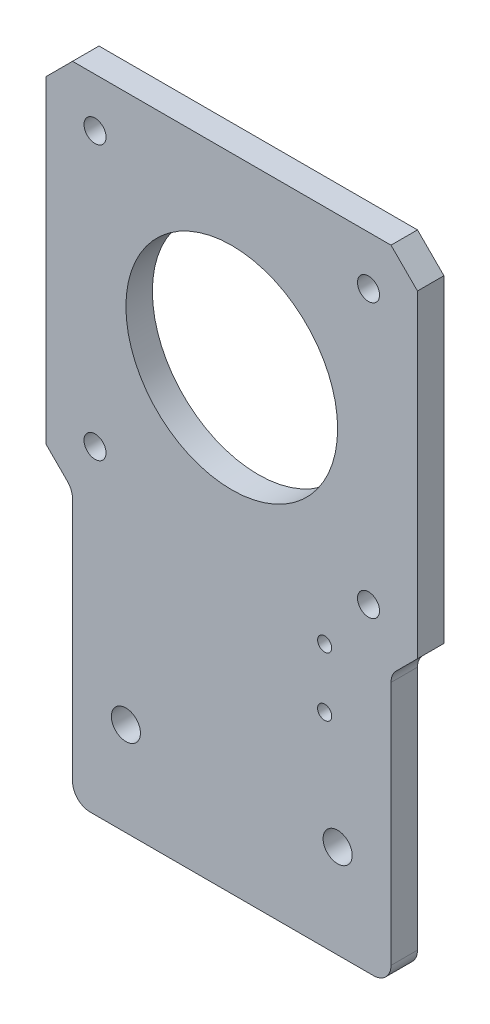
ISO-10303-21;
HEADER;
FILE_DESCRIPTION(('STEP AP214'),'2;1');
FILE_NAME('part.step','',(''),(''),'','','');
FILE_SCHEMA(('AUTOMOTIVE_DESIGN { 1 0 10303 214 1 1 1 1 }'));
ENDSEC;
DATA;
#1=APPLICATION_CONTEXT('core data for automotive mechanical design processes');
#2=APPLICATION_PROTOCOL_DEFINITION('international standard','automotive_design',2000,#1);
#3=PRODUCT_CONTEXT('',#1,'mechanical');
#4=PRODUCT('Part','Part','',(#3));
#5=PRODUCT_RELATED_PRODUCT_CATEGORY('part','',(#4));
#6=PRODUCT_DEFINITION_FORMATION('','',#4);
#7=PRODUCT_DEFINITION_CONTEXT('part definition',#1,'design');
#8=PRODUCT_DEFINITION('design','',#6,#7);
#9=PRODUCT_DEFINITION_SHAPE('','',#8);
#10=(LENGTH_UNIT() NAMED_UNIT(*) SI_UNIT(.MILLI.,.METRE.));
#11=(NAMED_UNIT(*) PLANE_ANGLE_UNIT() SI_UNIT($,.RADIAN.));
#12=(NAMED_UNIT(*) SI_UNIT($,.STERADIAN.) SOLID_ANGLE_UNIT());
#13=UNCERTAINTY_MEASURE_WITH_UNIT(LENGTH_MEASURE(1.E-05),#10,'distance_accuracy_value','');
#14=(GEOMETRIC_REPRESENTATION_CONTEXT(3) GLOBAL_UNCERTAINTY_ASSIGNED_CONTEXT((#13)) GLOBAL_UNIT_ASSIGNED_CONTEXT((#10,
#11,#12)) REPRESENTATION_CONTEXT('',''));
#15=CARTESIAN_POINT('',(0.,0.,0.));
#16=DIRECTION('',(0.,0.,1.));
#17=DIRECTION('',(1.,0.,0.));
#18=AXIS2_PLACEMENT_3D('',#15,#16,#17);
#19=CARTESIAN_POINT('',(0.,0.,3.));
#20=DIRECTION('',(0.,0.,-1.));
#21=DIRECTION('',(-1.,0.,0.));
#22=AXIS2_PLACEMENT_3D('',#19,#20,#21);
#23=PLANE('',#22);
#24=CARTESIAN_POINT('',(10.5294560297045,-21.8613101499908,3.));
#25=DIRECTION('',(0.,0.,1.));
#26=DIRECTION('',(1.,0.,0.));
#27=AXIS2_PLACEMENT_3D('',#24,#25,#26);
#28=CIRCLE('',#27,0.799999999999999);
#29=CARTESIAN_POINT('',(11.3294560297045,-21.8613101499908,3.));
#30=VERTEX_POINT('',#29);
#31=EDGE_CURVE('E327',#30,#30,#28,.T.);
#32=ORIENTED_EDGE('',*,*,#31,.F.);
#33=EDGE_LOOP('',(#32));
#34=FACE_BOUND('',#33,.T.);
#35=CARTESIAN_POINT('',(10.5294560297045,-28.5613101499908,3.));
#36=DIRECTION('',(0.,0.,1.));
#37=DIRECTION('',(1.,0.,0.));
#38=AXIS2_PLACEMENT_3D('',#35,#36,#37);
#39=CIRCLE('',#38,0.799999999999999);
#40=CARTESIAN_POINT('',(11.3294560297045,-28.5613101499908,3.));
#41=VERTEX_POINT('',#40);
#42=EDGE_CURVE('E329',#41,#41,#39,.T.);
#43=ORIENTED_EDGE('',*,*,#42,.F.);
#44=EDGE_LOOP('',(#43));
#45=FACE_BOUND('',#44,.T.);
#46=CARTESIAN_POINT('',(12.,-41.0549999999989,3.));
#47=DIRECTION('',(0.,0.,1.));
#48=DIRECTION('',(1.,0.,0.));
#49=AXIS2_PLACEMENT_3D('',#46,#47,#48);
#50=CIRCLE('',#49,1.65);
#51=CARTESIAN_POINT('',(13.65,-41.0549999999989,3.));
#52=VERTEX_POINT('',#51);
#53=EDGE_CURVE('E336',#52,#52,#50,.T.);
#54=ORIENTED_EDGE('',*,*,#53,.F.);
#55=EDGE_LOOP('',(#54));
#56=FACE_BOUND('',#55,.T.);
#57=CARTESIAN_POINT('',(-12.,-41.0549999999989,3.));
#58=DIRECTION('',(0.,0.,1.));
#59=DIRECTION('',(1.,0.,0.));
#60=AXIS2_PLACEMENT_3D('',#57,#58,#59);
#61=CIRCLE('',#60,1.65);
#62=CARTESIAN_POINT('',(-10.35,-41.0549999999989,3.));
#63=VERTEX_POINT('',#62);
#64=EDGE_CURVE('E342',#63,#63,#61,.T.);
#65=ORIENTED_EDGE('',*,*,#64,.F.);
#66=EDGE_LOOP('',(#65));
#67=FACE_BOUND('',#66,.T.);
#68=CARTESIAN_POINT('',(-15.5,15.4999999999999,3.));
#69=DIRECTION('',(0.,0.,1.));
#70=DIRECTION('',(1.,0.,0.));
#71=AXIS2_PLACEMENT_3D('',#68,#69,#70);
#72=CIRCLE('',#71,1.24999999999999);
#73=CARTESIAN_POINT('',(-14.25,15.4999999999999,3.));
#74=VERTEX_POINT('',#73);
#75=EDGE_CURVE('E348',#74,#74,#72,.T.);
#76=ORIENTED_EDGE('',*,*,#75,.F.);
#77=EDGE_LOOP('',(#76));
#78=FACE_BOUND('',#77,.T.);
#79=CARTESIAN_POINT('',(15.5,15.4999999999999,3.));
#80=DIRECTION('',(0.,0.,1.));
#81=DIRECTION('',(1.,0.,0.));
#82=AXIS2_PLACEMENT_3D('',#79,#80,#81);
#83=CIRCLE('',#82,1.24999999999999);
#84=CARTESIAN_POINT('',(16.75,15.4999999999999,3.));
#85=VERTEX_POINT('',#84);
#86=EDGE_CURVE('E354',#85,#85,#83,.T.);
#87=ORIENTED_EDGE('',*,*,#86,.F.);
#88=EDGE_LOOP('',(#87));
#89=FACE_BOUND('',#88,.T.);
#90=CARTESIAN_POINT('',(-15.5,-15.5000000000001,3.));
#91=DIRECTION('',(0.,0.,1.));
#92=DIRECTION('',(1.,0.,0.));
#93=AXIS2_PLACEMENT_3D('',#90,#91,#92);
#94=CIRCLE('',#93,1.24999999999999);
#95=CARTESIAN_POINT('',(-14.25,-15.5000000000001,3.));
#96=VERTEX_POINT('',#95);
#97=EDGE_CURVE('E360',#96,#96,#94,.T.);
#98=ORIENTED_EDGE('',*,*,#97,.F.);
#99=EDGE_LOOP('',(#98));
#100=FACE_BOUND('',#99,.T.);
#101=CARTESIAN_POINT('',(15.5,-15.5000000000001,3.));
#102=DIRECTION('',(0.,0.,1.));
#103=DIRECTION('',(1.,0.,0.));
#104=AXIS2_PLACEMENT_3D('',#101,#102,#103);
#105=CIRCLE('',#104,1.24999999999999);
#106=CARTESIAN_POINT('',(16.75,-15.5000000000001,3.));
#107=VERTEX_POINT('',#106);
#108=EDGE_CURVE('E366',#107,#107,#105,.T.);
#109=ORIENTED_EDGE('',*,*,#108,.F.);
#110=EDGE_LOOP('',(#109));
#111=FACE_BOUND('',#110,.T.);
#112=DIRECTION('',(1.,0.,0.));
#113=VECTOR('',#112,1.);
#114=CARTESIAN_POINT('',(18.05,-51.6550000000001,3.));
#115=LINE('',#114,#113);
#116=CARTESIAN_POINT('',(-16.05,-51.6550000000001,3.));
#117=VERTEX_POINT('',#116);
#118=CARTESIAN_POINT('',(16.05,-51.6550000000001,3.));
#119=VERTEX_POINT('',#118);
#120=EDGE_CURVE('E208',#117,#119,#115,.T.);
#121=ORIENTED_EDGE('',*,*,#120,.T.);
#122=CARTESIAN_POINT('',(16.05,-49.6550000000001,3.));
#123=DIRECTION('',(0.,0.,-1.));
#124=DIRECTION('',(-1.,0.,0.));
#125=AXIS2_PLACEMENT_3D('',#122,#123,#124);
#126=CIRCLE('',#125,2.);
#127=CARTESIAN_POINT('',(18.05,-49.6550000000001,3.));
#128=VERTEX_POINT('',#127);
#129=EDGE_CURVE('E185',#119,#128,#126,.F.);
#130=ORIENTED_EDGE('',*,*,#129,.T.);
#131=DIRECTION('',(0.,1.,0.));
#132=VECTOR('',#131,1.);
#133=CARTESIAN_POINT('',(18.05,-51.6550000000001,3.));
#134=LINE('',#133,#132);
#135=CARTESIAN_POINT('',(18.05,-21.8784271247463,3.));
#136=VERTEX_POINT('',#135);
#137=EDGE_CURVE('E210',#128,#136,#134,.T.);
#138=ORIENTED_EDGE('',*,*,#137,.T.);
#139=CARTESIAN_POINT('',(20.05,-21.8784271247463,3.));
#140=DIRECTION('',(0.,0.,-1.));
#141=DIRECTION('',(-1.,0.,0.));
#142=AXIS2_PLACEMENT_3D('',#139,#140,#141);
#143=CIRCLE('',#142,2.);
#144=CARTESIAN_POINT('',(18.6357864376269,-20.4642135623732,3.));
#145=VERTEX_POINT('',#144);
#146=EDGE_CURVE('E194',#136,#145,#143,.T.);
#147=ORIENTED_EDGE('',*,*,#146,.T.);
#148=DIRECTION('',(0.707106781186547,0.707106781186548,0.));
#149=VECTOR('',#148,1.);
#150=CARTESIAN_POINT('',(18.05,-21.0500000000001,3.));
#151=LINE('',#150,#149);
#152=CARTESIAN_POINT('',(21.05,-18.0500000000001,3.));
#153=VERTEX_POINT('',#152);
#154=EDGE_CURVE('E215',#145,#153,#151,.T.);
#155=ORIENTED_EDGE('',*,*,#154,.T.);
#156=DIRECTION('',(0.,1.,0.));
#157=VECTOR('',#156,1.);
#158=CARTESIAN_POINT('',(21.05,-18.0500000000001,3.));
#159=LINE('',#158,#157);
#160=CARTESIAN_POINT('',(21.05,18.0499999999999,3.));
#161=VERTEX_POINT('',#160);
#162=EDGE_CURVE('E217',#153,#161,#159,.T.);
#163=ORIENTED_EDGE('',*,*,#162,.T.);
#164=DIRECTION('',(-0.707106781186547,0.707106781186548,0.));
#165=VECTOR('',#164,1.);
#166=CARTESIAN_POINT('',(21.05,18.0499999999999,3.));
#167=LINE('',#166,#165);
#168=CARTESIAN_POINT('',(18.05,21.0499999999999,3.));
#169=VERTEX_POINT('',#168);
#170=EDGE_CURVE('E219',#161,#169,#167,.T.);
#171=ORIENTED_EDGE('',*,*,#170,.T.);
#172=DIRECTION('',(-1.,0.,0.));
#173=VECTOR('',#172,1.);
#174=CARTESIAN_POINT('',(18.05,21.0499999999999,3.));
#175=LINE('',#174,#173);
#176=CARTESIAN_POINT('',(-18.05,21.0499999999999,3.));
#177=VERTEX_POINT('',#176);
#178=EDGE_CURVE('E221',#169,#177,#175,.T.);
#179=ORIENTED_EDGE('',*,*,#178,.T.);
#180=DIRECTION('',(-0.707106781186547,-0.707106781186548,0.));
#181=VECTOR('',#180,1.);
#182=CARTESIAN_POINT('',(-18.05,21.0499999999999,3.));
#183=LINE('',#182,#181);
#184=CARTESIAN_POINT('',(-21.05,18.0499999999999,3.));
#185=VERTEX_POINT('',#184);
#186=EDGE_CURVE('E150',#177,#185,#183,.T.);
#187=ORIENTED_EDGE('',*,*,#186,.T.);
#188=DIRECTION('',(0.,-1.,0.));
#189=VECTOR('',#188,1.);
#190=CARTESIAN_POINT('',(-21.05,18.0499999999999,3.));
#191=LINE('',#190,#189);
#192=CARTESIAN_POINT('',(-21.05,-18.0500000000001,3.));
#193=VERTEX_POINT('',#192);
#194=EDGE_CURVE('E144',#185,#193,#191,.T.);
#195=ORIENTED_EDGE('',*,*,#194,.T.);
#196=DIRECTION('',(0.707106781186548,-0.707106781186548,0.));
#197=VECTOR('',#196,1.);
#198=CARTESIAN_POINT('',(-21.05,-18.0500000000001,3.));
#199=LINE('',#198,#197);
#200=CARTESIAN_POINT('',(-18.6357864376269,-20.4642135623732,3.));
#201=VERTEX_POINT('',#200);
#202=EDGE_CURVE('E134',#193,#201,#199,.T.);
#203=ORIENTED_EDGE('',*,*,#202,.T.);
#204=CARTESIAN_POINT('',(-20.05,-21.8784271247463,3.));
#205=DIRECTION('',(0.,0.,-1.));
#206=DIRECTION('',(-1.,0.,0.));
#207=AXIS2_PLACEMENT_3D('',#204,#205,#206);
#208=CIRCLE('',#207,2.);
#209=CARTESIAN_POINT('',(-18.05,-21.8784271247463,3.));
#210=VERTEX_POINT('',#209);
#211=EDGE_CURVE('E11',#201,#210,#208,.T.);
#212=ORIENTED_EDGE('',*,*,#211,.T.);
#213=DIRECTION('',(0.,-1.,0.));
#214=VECTOR('',#213,1.);
#215=CARTESIAN_POINT('',(-18.05,-51.6550000000001,3.));
#216=LINE('',#215,#214);
#217=CARTESIAN_POINT('',(-18.05,-49.6550000000001,3.));
#218=VERTEX_POINT('',#217);
#219=EDGE_CURVE('E143',#210,#218,#216,.T.);
#220=ORIENTED_EDGE('',*,*,#219,.T.);
#221=CARTESIAN_POINT('',(-16.05,-49.6550000000001,3.));
#222=DIRECTION('',(0.,0.,-1.));
#223=DIRECTION('',(-1.,0.,0.));
#224=AXIS2_PLACEMENT_3D('',#221,#222,#223);
#225=CIRCLE('',#224,2.);
#226=EDGE_CURVE('E183',#218,#117,#225,.F.);
#227=ORIENTED_EDGE('',*,*,#226,.T.);
#228=EDGE_LOOP('',(#121,#130,#138,#147,#155,#163,#171,#179,#187,#195,#203,#212,#220,#227));
#229=FACE_BOUND('',#228,.T.);
#230=CARTESIAN_POINT('',(0.,-1.11022302462516E-13,3.));
#231=DIRECTION('',(0.,0.,1.));
#232=DIRECTION('',(1.,0.,0.));
#233=AXIS2_PLACEMENT_3D('',#230,#231,#232);
#234=CIRCLE('',#233,12.);
#235=CARTESIAN_POINT('',(12.,-1.11022302462516E-13,3.));
#236=VERTEX_POINT('',#235);
#237=EDGE_CURVE('E225',#236,#236,#234,.T.);
#238=ORIENTED_EDGE('',*,*,#237,.F.);
#239=EDGE_LOOP('',(#238));
#240=FACE_BOUND('',#239,.T.);
#241=ADVANCED_FACE('F33',(#34,#45,#56,#67,#78,#89,#100,#111,#229,#240),#23,.F.);
#242=CARTESIAN_POINT('',(0.,0.,0.));
#243=DIRECTION('',(0.,0.,-1.));
#244=DIRECTION('',(-1.,0.,0.));
#245=AXIS2_PLACEMENT_3D('',#242,#243,#244);
#246=PLANE('',#245);
#247=CARTESIAN_POINT('',(10.5294560297045,-21.8613101499908,0.));
#248=DIRECTION('',(0.,0.,-1.));
#249=DIRECTION('',(-1.,0.,0.));
#250=AXIS2_PLACEMENT_3D('',#247,#248,#249);
#251=CIRCLE('',#250,0.799999999999999);
#252=CARTESIAN_POINT('',(9.72945602970451,-21.8613101499908,0.));
#253=VERTEX_POINT('',#252);
#254=EDGE_CURVE('E37',#253,#253,#251,.T.);
#255=ORIENTED_EDGE('',*,*,#254,.F.);
#256=EDGE_LOOP('',(#255));
#257=FACE_BOUND('',#256,.T.);
#258=CARTESIAN_POINT('',(10.5294560297045,-28.5613101499908,0.));
#259=DIRECTION('',(0.,0.,-1.));
#260=DIRECTION('',(-1.,0.,0.));
#261=AXIS2_PLACEMENT_3D('',#258,#259,#260);
#262=CIRCLE('',#261,0.799999999999999);
#263=CARTESIAN_POINT('',(9.72945602970451,-28.5613101499908,0.));
#264=VERTEX_POINT('',#263);
#265=EDGE_CURVE('E333',#264,#264,#262,.T.);
#266=ORIENTED_EDGE('',*,*,#265,.F.);
#267=EDGE_LOOP('',(#266));
#268=FACE_BOUND('',#267,.T.);
#269=CARTESIAN_POINT('',(12.,-41.0549999999989,0.));
#270=DIRECTION('',(0.,0.,-1.));
#271=DIRECTION('',(-1.,0.,0.));
#272=AXIS2_PLACEMENT_3D('',#269,#270,#271);
#273=CIRCLE('',#272,1.65);
#274=CARTESIAN_POINT('',(10.35,-41.0549999999989,0.));
#275=VERTEX_POINT('',#274);
#276=EDGE_CURVE('E339',#275,#275,#273,.T.);
#277=ORIENTED_EDGE('',*,*,#276,.F.);
#278=EDGE_LOOP('',(#277));
#279=FACE_BOUND('',#278,.T.);
#280=CARTESIAN_POINT('',(-12.,-41.0549999999989,0.));
#281=DIRECTION('',(0.,0.,-1.));
#282=DIRECTION('',(-1.,0.,0.));
#283=AXIS2_PLACEMENT_3D('',#280,#281,#282);
#284=CIRCLE('',#283,1.65);
#285=CARTESIAN_POINT('',(-13.65,-41.0549999999989,0.));
#286=VERTEX_POINT('',#285);
#287=EDGE_CURVE('E345',#286,#286,#284,.T.);
#288=ORIENTED_EDGE('',*,*,#287,.F.);
#289=EDGE_LOOP('',(#288));
#290=FACE_BOUND('',#289,.T.);
#291=CARTESIAN_POINT('',(-15.5,15.4999999999999,0.));
#292=DIRECTION('',(0.,0.,-1.));
#293=DIRECTION('',(-1.,0.,0.));
#294=AXIS2_PLACEMENT_3D('',#291,#292,#293);
#295=CIRCLE('',#294,1.24999999999999);
#296=CARTESIAN_POINT('',(-16.75,15.4999999999999,0.));
#297=VERTEX_POINT('',#296);
#298=EDGE_CURVE('E351',#297,#297,#295,.T.);
#299=ORIENTED_EDGE('',*,*,#298,.F.);
#300=EDGE_LOOP('',(#299));
#301=FACE_BOUND('',#300,.T.);
#302=CARTESIAN_POINT('',(15.5,15.4999999999999,0.));
#303=DIRECTION('',(0.,0.,-1.));
#304=DIRECTION('',(-1.,0.,0.));
#305=AXIS2_PLACEMENT_3D('',#302,#303,#304);
#306=CIRCLE('',#305,1.24999999999999);
#307=CARTESIAN_POINT('',(14.25,15.4999999999999,0.));
#308=VERTEX_POINT('',#307);
#309=EDGE_CURVE('E357',#308,#308,#306,.T.);
#310=ORIENTED_EDGE('',*,*,#309,.F.);
#311=EDGE_LOOP('',(#310));
#312=FACE_BOUND('',#311,.T.);
#313=CARTESIAN_POINT('',(-15.5,-15.5000000000001,0.));
#314=DIRECTION('',(0.,0.,-1.));
#315=DIRECTION('',(-1.,0.,0.));
#316=AXIS2_PLACEMENT_3D('',#313,#314,#315);
#317=CIRCLE('',#316,1.24999999999999);
#318=CARTESIAN_POINT('',(-16.75,-15.5000000000001,0.));
#319=VERTEX_POINT('',#318);
#320=EDGE_CURVE('E363',#319,#319,#317,.T.);
#321=ORIENTED_EDGE('',*,*,#320,.F.);
#322=EDGE_LOOP('',(#321));
#323=FACE_BOUND('',#322,.T.);
#324=CARTESIAN_POINT('',(15.5,-15.5000000000001,0.));
#325=DIRECTION('',(0.,0.,-1.));
#326=DIRECTION('',(-1.,0.,0.));
#327=AXIS2_PLACEMENT_3D('',#324,#325,#326);
#328=CIRCLE('',#327,1.24999999999999);
#329=CARTESIAN_POINT('',(14.25,-15.5000000000001,0.));
#330=VERTEX_POINT('',#329);
#331=EDGE_CURVE('E369',#330,#330,#328,.T.);
#332=ORIENTED_EDGE('',*,*,#331,.F.);
#333=EDGE_LOOP('',(#332));
#334=FACE_BOUND('',#333,.T.);
#335=DIRECTION('',(0.,1.,0.));
#336=VECTOR('',#335,1.);
#337=CARTESIAN_POINT('',(18.05,-51.6550000000001,0.));
#338=LINE('',#337,#336);
#339=CARTESIAN_POINT('',(18.05,-49.6550000000001,0.));
#340=VERTEX_POINT('',#339);
#341=CARTESIAN_POINT('',(18.05,-21.8784271247463,0.));
#342=VERTEX_POINT('',#341);
#343=EDGE_CURVE('E231',#340,#342,#338,.T.);
#344=ORIENTED_EDGE('',*,*,#343,.F.);
#345=CARTESIAN_POINT('',(16.05,-49.6550000000001,0.));
#346=DIRECTION('',(0.,0.,-1.));
#347=DIRECTION('',(-1.,0.,0.));
#348=AXIS2_PLACEMENT_3D('',#345,#346,#347);
#349=CIRCLE('',#348,2.);
#350=CARTESIAN_POINT('',(16.05,-51.6550000000001,0.));
#351=VERTEX_POINT('',#350);
#352=EDGE_CURVE('E176',#340,#351,#349,.T.);
#353=ORIENTED_EDGE('',*,*,#352,.T.);
#354=DIRECTION('',(1.,0.,0.));
#355=VECTOR('',#354,1.);
#356=CARTESIAN_POINT('',(18.05,-51.6550000000001,0.));
#357=LINE('',#356,#355);
#358=CARTESIAN_POINT('',(-16.05,-51.6550000000001,0.));
#359=VERTEX_POINT('',#358);
#360=EDGE_CURVE('E228',#359,#351,#357,.T.);
#361=ORIENTED_EDGE('',*,*,#360,.F.);
#362=CARTESIAN_POINT('',(-16.05,-49.6550000000001,0.));
#363=DIRECTION('',(0.,0.,-1.));
#364=DIRECTION('',(-1.,0.,0.));
#365=AXIS2_PLACEMENT_3D('',#362,#363,#364);
#366=CIRCLE('',#365,2.);
#367=CARTESIAN_POINT('',(-18.05,-49.6550000000001,0.));
#368=VERTEX_POINT('',#367);
#369=EDGE_CURVE('E174',#359,#368,#366,.T.);
#370=ORIENTED_EDGE('',*,*,#369,.T.);
#371=DIRECTION('',(0.,-1.,0.));
#372=VECTOR('',#371,1.);
#373=CARTESIAN_POINT('',(-18.05,-51.6550000000001,0.));
#374=LINE('',#373,#372);
#375=CARTESIAN_POINT('',(-18.05,-21.8784271247463,0.));
#376=VERTEX_POINT('',#375);
#377=EDGE_CURVE('E202',#376,#368,#374,.T.);
#378=ORIENTED_EDGE('',*,*,#377,.F.);
#379=CARTESIAN_POINT('',(-20.05,-21.8784271247463,0.));
#380=DIRECTION('',(0.,0.,-1.));
#381=DIRECTION('',(-1.,0.,0.));
#382=AXIS2_PLACEMENT_3D('',#379,#380,#381);
#383=CIRCLE('',#382,2.);
#384=CARTESIAN_POINT('',(-18.6357864376269,-20.4642135623732,0.));
#385=VERTEX_POINT('',#384);
#386=EDGE_CURVE('E42',#376,#385,#383,.F.);
#387=ORIENTED_EDGE('',*,*,#386,.T.);
#388=DIRECTION('',(0.707106781186548,-0.707106781186548,0.));
#389=VECTOR('',#388,1.);
#390=CARTESIAN_POINT('',(-21.05,-18.0500000000001,0.));
#391=LINE('',#390,#389);
#392=CARTESIAN_POINT('',(-21.05,-18.0500000000001,0.));
#393=VERTEX_POINT('',#392);
#394=EDGE_CURVE('E201',#393,#385,#391,.T.);
#395=ORIENTED_EDGE('',*,*,#394,.F.);
#396=DIRECTION('',(0.,-1.,0.));
#397=VECTOR('',#396,1.);
#398=CARTESIAN_POINT('',(-21.05,18.0499999999999,0.));
#399=LINE('',#398,#397);
#400=CARTESIAN_POINT('',(-21.05,18.0499999999999,0.));
#401=VERTEX_POINT('',#400);
#402=EDGE_CURVE('E158',#401,#393,#399,.T.);
#403=ORIENTED_EDGE('',*,*,#402,.F.);
#404=DIRECTION('',(-0.707106781186547,-0.707106781186548,0.));
#405=VECTOR('',#404,1.);
#406=CARTESIAN_POINT('',(-18.05,21.0499999999999,0.));
#407=LINE('',#406,#405);
#408=CARTESIAN_POINT('',(-18.05,21.0499999999999,0.));
#409=VERTEX_POINT('',#408);
#410=EDGE_CURVE('E154',#409,#401,#407,.T.);
#411=ORIENTED_EDGE('',*,*,#410,.F.);
#412=DIRECTION('',(-1.,0.,0.));
#413=VECTOR('',#412,1.);
#414=CARTESIAN_POINT('',(18.05,21.0499999999999,0.));
#415=LINE('',#414,#413);
#416=CARTESIAN_POINT('',(18.05,21.0499999999999,0.));
#417=VERTEX_POINT('',#416);
#418=EDGE_CURVE('E240',#417,#409,#415,.T.);
#419=ORIENTED_EDGE('',*,*,#418,.F.);
#420=DIRECTION('',(-0.707106781186547,0.707106781186548,0.));
#421=VECTOR('',#420,1.);
#422=CARTESIAN_POINT('',(21.05,18.0499999999999,0.));
#423=LINE('',#422,#421);
#424=CARTESIAN_POINT('',(21.05,18.0499999999999,0.));
#425=VERTEX_POINT('',#424);
#426=EDGE_CURVE('E238',#425,#417,#423,.T.);
#427=ORIENTED_EDGE('',*,*,#426,.F.);
#428=DIRECTION('',(0.,1.,0.));
#429=VECTOR('',#428,1.);
#430=CARTESIAN_POINT('',(21.05,-18.0500000000001,0.));
#431=LINE('',#430,#429);
#432=CARTESIAN_POINT('',(21.05,-18.0500000000001,0.));
#433=VERTEX_POINT('',#432);
#434=EDGE_CURVE('E236',#433,#425,#431,.T.);
#435=ORIENTED_EDGE('',*,*,#434,.F.);
#436=DIRECTION('',(0.707106781186547,0.707106781186548,0.));
#437=VECTOR('',#436,1.);
#438=CARTESIAN_POINT('',(18.05,-21.0500000000001,0.));
#439=LINE('',#438,#437);
#440=CARTESIAN_POINT('',(18.6357864376269,-20.4642135623732,0.));
#441=VERTEX_POINT('',#440);
#442=EDGE_CURVE('E234',#441,#433,#439,.T.);
#443=ORIENTED_EDGE('',*,*,#442,.F.);
#444=CARTESIAN_POINT('',(20.05,-21.8784271247463,0.));
#445=DIRECTION('',(0.,0.,-1.));
#446=DIRECTION('',(-1.,0.,0.));
#447=AXIS2_PLACEMENT_3D('',#444,#445,#446);
#448=CIRCLE('',#447,2.);
#449=EDGE_CURVE('E192',#441,#342,#448,.F.);
#450=ORIENTED_EDGE('',*,*,#449,.T.);
#451=EDGE_LOOP('',(#344,#353,#361,#370,#378,#387,#395,#403,#411,#419,#427,#435,#443,#450));
#452=FACE_BOUND('',#451,.T.);
#453=CARTESIAN_POINT('',(0.,-1.11022302462516E-13,0.));
#454=DIRECTION('',(0.,0.,1.));
#455=DIRECTION('',(1.,0.,0.));
#456=AXIS2_PLACEMENT_3D('',#453,#454,#455);
#457=CIRCLE('',#456,12.);
#458=CARTESIAN_POINT('',(12.,-1.11022302462516E-13,0.));
#459=VERTEX_POINT('',#458);
#460=EDGE_CURVE('E372',#459,#459,#457,.T.);
#461=ORIENTED_EDGE('',*,*,#460,.T.);
#462=EDGE_LOOP('',(#461));
#463=FACE_BOUND('',#462,.T.);
#464=ADVANCED_FACE('F199',(#257,#268,#279,#290,#301,#312,#323,#334,#452,#463),#246,.T.);
#465=CARTESIAN_POINT('',(-21.05,18.0499999999999,3.));
#466=DIRECTION('',(1.,0.,0.));
#467=DIRECTION('',(0.,0.,-1.));
#468=AXIS2_PLACEMENT_3D('',#465,#466,#467);
#469=PLANE('',#468);
#470=ORIENTED_EDGE('',*,*,#402,.T.);
#471=DIRECTION('',(0.,0.,-1.));
#472=VECTOR('',#471,1.);
#473=CARTESIAN_POINT('',(-21.05,-18.0500000000001,3.));
#474=LINE('',#473,#472);
#475=EDGE_CURVE('E139',#193,#393,#474,.T.);
#476=ORIENTED_EDGE('',*,*,#475,.F.);
#477=ORIENTED_EDGE('',*,*,#194,.F.);
#478=DIRECTION('',(0.,0.,-1.));
#479=VECTOR('',#478,1.);
#480=CARTESIAN_POINT('',(-21.05,18.0499999999999,3.));
#481=LINE('',#480,#479);
#482=EDGE_CURVE('E224',#185,#401,#481,.T.);
#483=ORIENTED_EDGE('',*,*,#482,.T.);
#484=EDGE_LOOP('',(#470,#476,#477,#483));
#485=FACE_BOUND('',#484,.T.);
#486=ADVANCED_FACE('F156',(#485),#469,.F.);
#487=CARTESIAN_POINT('',(-21.05,-18.0500000000001,3.));
#488=DIRECTION('',(0.707106781186547,0.707106781186547,0.));
#489=DIRECTION('',(-0.707106781186548,0.707106781186548,0.));
#490=AXIS2_PLACEMENT_3D('',#487,#488,#489);
#491=PLANE('',#490);
#492=ORIENTED_EDGE('',*,*,#394,.T.);
#493=DIRECTION('',(0.,0.,-1.));
#494=VECTOR('',#493,1.);
#495=CARTESIAN_POINT('',(-18.6357864376269,-20.4642135623732,3.));
#496=LINE('',#495,#494);
#497=EDGE_CURVE('E142',#385,#201,#496,.F.);
#498=ORIENTED_EDGE('',*,*,#497,.T.);
#499=ORIENTED_EDGE('',*,*,#202,.F.);
#500=ORIENTED_EDGE('',*,*,#475,.T.);
#501=EDGE_LOOP('',(#492,#498,#499,#500));
#502=FACE_BOUND('',#501,.T.);
#503=ADVANCED_FACE('F137',(#502),#491,.F.);
#504=CARTESIAN_POINT('',(-18.05,-51.6550000000001,3.));
#505=DIRECTION('',(1.,0.,0.));
#506=DIRECTION('',(0.,1.,0.));
#507=AXIS2_PLACEMENT_3D('',#504,#505,#506);
#508=PLANE('',#507);
#509=ORIENTED_EDGE('',*,*,#377,.T.);
#510=DIRECTION('',(0.,0.,-1.));
#511=VECTOR('',#510,1.);
#512=CARTESIAN_POINT('',(-18.05,-49.6550000000001,3.));
#513=LINE('',#512,#511);
#514=EDGE_CURVE('E49',#368,#218,#513,.F.);
#515=ORIENTED_EDGE('',*,*,#514,.T.);
#516=ORIENTED_EDGE('',*,*,#219,.F.);
#517=DIRECTION('',(0.,0.,-1.));
#518=VECTOR('',#517,1.);
#519=CARTESIAN_POINT('',(-18.05,-21.8784271247463,0.));
#520=LINE('',#519,#518);
#521=EDGE_CURVE('E187',#210,#376,#520,.T.);
#522=ORIENTED_EDGE('',*,*,#521,.T.);
#523=EDGE_LOOP('',(#509,#515,#516,#522));
#524=FACE_BOUND('',#523,.T.);
#525=ADVANCED_FACE('F206',(#524),#508,.F.);
#526=CARTESIAN_POINT('',(18.05,-51.6550000000001,3.));
#527=DIRECTION('',(0.,1.,0.));
#528=DIRECTION('',(0.,0.,1.));
#529=AXIS2_PLACEMENT_3D('',#526,#527,#528);
#530=PLANE('',#529);
#531=ORIENTED_EDGE('',*,*,#360,.T.);
#532=DIRECTION('',(0.,0.,-1.));
#533=VECTOR('',#532,1.);
#534=CARTESIAN_POINT('',(16.05,-51.6550000000001,3.));
#535=LINE('',#534,#533);
#536=EDGE_CURVE('E181',#351,#119,#535,.F.);
#537=ORIENTED_EDGE('',*,*,#536,.T.);
#538=ORIENTED_EDGE('',*,*,#120,.F.);
#539=DIRECTION('',(0.,0.,-1.));
#540=VECTOR('',#539,1.);
#541=CARTESIAN_POINT('',(-16.05,-51.6550000000001,3.));
#542=LINE('',#541,#540);
#543=EDGE_CURVE('E178',#117,#359,#542,.T.);
#544=ORIENTED_EDGE('',*,*,#543,.T.);
#545=EDGE_LOOP('',(#531,#537,#538,#544));
#546=FACE_BOUND('',#545,.T.);
#547=ADVANCED_FACE('F528',(#546),#530,.F.);
#548=CARTESIAN_POINT('',(18.05,-51.6550000000001,3.));
#549=DIRECTION('',(-1.,0.,0.));
#550=DIRECTION('',(0.,-1.,0.));
#551=AXIS2_PLACEMENT_3D('',#548,#549,#550);
#552=PLANE('',#551);
#553=ORIENTED_EDGE('',*,*,#343,.T.);
#554=DIRECTION('',(0.,0.,-1.));
#555=VECTOR('',#554,1.);
#556=CARTESIAN_POINT('',(18.05,-21.8784271247463,3.));
#557=LINE('',#556,#555);
#558=EDGE_CURVE('E172',#342,#136,#557,.F.);
#559=ORIENTED_EDGE('',*,*,#558,.T.);
#560=ORIENTED_EDGE('',*,*,#137,.F.);
#561=DIRECTION('',(0.,0.,-1.));
#562=VECTOR('',#561,1.);
#563=CARTESIAN_POINT('',(18.05,-49.6550000000001,3.));
#564=LINE('',#563,#562);
#565=EDGE_CURVE('E163',#128,#340,#564,.T.);
#566=ORIENTED_EDGE('',*,*,#565,.T.);
#567=EDGE_LOOP('',(#553,#559,#560,#566));
#568=FACE_BOUND('',#567,.T.);
#569=ADVANCED_FACE('F535',(#568),#552,.F.);
#570=CARTESIAN_POINT('',(18.05,-21.0500000000001,3.));
#571=DIRECTION('',(-0.707106781186548,0.707106781186547,0.));
#572=DIRECTION('',(-0.707106781186547,-0.707106781186548,0.));
#573=AXIS2_PLACEMENT_3D('',#570,#571,#572);
#574=PLANE('',#573);
#575=ORIENTED_EDGE('',*,*,#154,.F.);
#576=DIRECTION('',(0.,0.,-1.));
#577=VECTOR('',#576,1.);
#578=CARTESIAN_POINT('',(18.6357864376269,-20.4642135623732,0.));
#579=LINE('',#578,#577);
#580=EDGE_CURVE('E159',#145,#441,#579,.T.);
#581=ORIENTED_EDGE('',*,*,#580,.T.);
#582=ORIENTED_EDGE('',*,*,#442,.T.);
#583=DIRECTION('',(0.,0.,-1.));
#584=VECTOR('',#583,1.);
#585=CARTESIAN_POINT('',(21.05,-18.0500000000001,3.));
#586=LINE('',#585,#584);
#587=EDGE_CURVE('E160',#153,#433,#586,.T.);
#588=ORIENTED_EDGE('',*,*,#587,.F.);
#589=EDGE_LOOP('',(#575,#581,#582,#588));
#590=FACE_BOUND('',#589,.T.);
#591=ADVANCED_FACE('F503',(#590),#574,.F.);
#592=CARTESIAN_POINT('',(21.05,-18.0500000000001,3.));
#593=DIRECTION('',(-1.,0.,0.));
#594=DIRECTION('',(0.,0.,1.));
#595=AXIS2_PLACEMENT_3D('',#592,#593,#594);
#596=PLANE('',#595);
#597=ORIENTED_EDGE('',*,*,#434,.T.);
#598=DIRECTION('',(0.,0.,-1.));
#599=VECTOR('',#598,1.);
#600=CARTESIAN_POINT('',(21.05,18.0499999999999,3.));
#601=LINE('',#600,#599);
#602=EDGE_CURVE('E166',#161,#425,#601,.T.);
#603=ORIENTED_EDGE('',*,*,#602,.F.);
#604=ORIENTED_EDGE('',*,*,#162,.F.);
#605=ORIENTED_EDGE('',*,*,#587,.T.);
#606=EDGE_LOOP('',(#597,#603,#604,#605));
#607=FACE_BOUND('',#606,.T.);
#608=ADVANCED_FACE('F494',(#607),#596,.F.);
#609=CARTESIAN_POINT('',(21.05,18.0499999999999,3.));
#610=DIRECTION('',(-0.707106781186548,-0.707106781186547,0.));
#611=DIRECTION('',(0.707106781186547,-0.707106781186548,0.));
#612=AXIS2_PLACEMENT_3D('',#609,#610,#611);
#613=PLANE('',#612);
#614=ORIENTED_EDGE('',*,*,#426,.T.);
#615=DIRECTION('',(0.,0.,-1.));
#616=VECTOR('',#615,1.);
#617=CARTESIAN_POINT('',(18.05,21.0499999999999,3.));
#618=LINE('',#617,#616);
#619=EDGE_CURVE('E247',#169,#417,#618,.T.);
#620=ORIENTED_EDGE('',*,*,#619,.F.);
#621=ORIENTED_EDGE('',*,*,#170,.F.);
#622=ORIENTED_EDGE('',*,*,#602,.T.);
#623=EDGE_LOOP('',(#614,#620,#621,#622));
#624=FACE_BOUND('',#623,.T.);
#625=ADVANCED_FACE('F254',(#624),#613,.F.);
#626=CARTESIAN_POINT('',(18.05,21.0499999999999,3.));
#627=DIRECTION('',(0.,-1.,0.));
#628=DIRECTION('',(0.,0.,-1.));
#629=AXIS2_PLACEMENT_3D('',#626,#627,#628);
#630=PLANE('',#629);
#631=ORIENTED_EDGE('',*,*,#418,.T.);
#632=DIRECTION('',(0.,0.,-1.));
#633=VECTOR('',#632,1.);
#634=CARTESIAN_POINT('',(-18.05,21.0499999999999,3.));
#635=LINE('',#634,#633);
#636=EDGE_CURVE('E244',#177,#409,#635,.T.);
#637=ORIENTED_EDGE('',*,*,#636,.F.);
#638=ORIENTED_EDGE('',*,*,#178,.F.);
#639=ORIENTED_EDGE('',*,*,#619,.T.);
#640=EDGE_LOOP('',(#631,#637,#638,#639));
#641=FACE_BOUND('',#640,.T.);
#642=ADVANCED_FACE('F264',(#641),#630,.F.);
#643=CARTESIAN_POINT('',(-18.05,21.0499999999999,3.));
#644=DIRECTION('',(0.707106781186548,-0.707106781186547,0.));
#645=DIRECTION('',(0.707106781186547,0.707106781186548,0.));
#646=AXIS2_PLACEMENT_3D('',#643,#644,#645);
#647=PLANE('',#646);
#648=ORIENTED_EDGE('',*,*,#410,.T.);
#649=ORIENTED_EDGE('',*,*,#482,.F.);
#650=ORIENTED_EDGE('',*,*,#186,.F.);
#651=ORIENTED_EDGE('',*,*,#636,.T.);
#652=EDGE_LOOP('',(#648,#649,#650,#651));
#653=FACE_BOUND('',#652,.T.);
#654=ADVANCED_FACE('F267',(#653),#647,.F.);
#655=CARTESIAN_POINT('',(0.,-1.11022302462516E-13,3.));
#656=DIRECTION('',(0.,0.,-1.));
#657=DIRECTION('',(-1.,0.,0.));
#658=AXIS2_PLACEMENT_3D('',#655,#656,#657);
#659=CYLINDRICAL_SURFACE('',#658,12.);
#660=ORIENTED_EDGE('',*,*,#237,.T.);
#661=EDGE_LOOP('',(#660));
#662=FACE_BOUND('',#661,.T.);
#663=ORIENTED_EDGE('',*,*,#460,.F.);
#664=EDGE_LOOP('',(#663));
#665=FACE_BOUND('',#664,.T.);
#666=ADVANCED_FACE('F269',(#662,#665),#659,.F.);
#667=CARTESIAN_POINT('',(15.5,-15.5000000000001,3.));
#668=DIRECTION('',(0.,0.,1.));
#669=DIRECTION('',(1.,0.,0.));
#670=AXIS2_PLACEMENT_3D('',#667,#668,#669);
#671=CYLINDRICAL_SURFACE('',#670,1.24999999999999);
#672=ORIENTED_EDGE('',*,*,#331,.T.);
#673=EDGE_LOOP('',(#672));
#674=FACE_BOUND('',#673,.T.);
#675=ORIENTED_EDGE('',*,*,#108,.T.);
#676=EDGE_LOOP('',(#675));
#677=FACE_BOUND('',#676,.T.);
#678=ADVANCED_FACE('F275',(#674,#677),#671,.F.);
#679=CARTESIAN_POINT('',(-15.5,-15.5000000000001,3.));
#680=DIRECTION('',(0.,0.,1.));
#681=DIRECTION('',(1.,0.,0.));
#682=AXIS2_PLACEMENT_3D('',#679,#680,#681);
#683=CYLINDRICAL_SURFACE('',#682,1.24999999999999);
#684=ORIENTED_EDGE('',*,*,#320,.T.);
#685=EDGE_LOOP('',(#684));
#686=FACE_BOUND('',#685,.T.);
#687=ORIENTED_EDGE('',*,*,#97,.T.);
#688=EDGE_LOOP('',(#687));
#689=FACE_BOUND('',#688,.T.);
#690=ADVANCED_FACE('F292',(#686,#689),#683,.F.);
#691=CARTESIAN_POINT('',(15.5,15.4999999999999,3.));
#692=DIRECTION('',(0.,0.,1.));
#693=DIRECTION('',(1.,0.,0.));
#694=AXIS2_PLACEMENT_3D('',#691,#692,#693);
#695=CYLINDRICAL_SURFACE('',#694,1.24999999999999);
#696=ORIENTED_EDGE('',*,*,#309,.T.);
#697=EDGE_LOOP('',(#696));
#698=FACE_BOUND('',#697,.T.);
#699=ORIENTED_EDGE('',*,*,#86,.T.);
#700=EDGE_LOOP('',(#699));
#701=FACE_BOUND('',#700,.T.);
#702=ADVANCED_FACE('F296',(#698,#701),#695,.F.);
#703=CARTESIAN_POINT('',(-15.5,15.4999999999999,3.));
#704=DIRECTION('',(0.,0.,1.));
#705=DIRECTION('',(1.,0.,0.));
#706=AXIS2_PLACEMENT_3D('',#703,#704,#705);
#707=CYLINDRICAL_SURFACE('',#706,1.24999999999999);
#708=ORIENTED_EDGE('',*,*,#298,.T.);
#709=EDGE_LOOP('',(#708));
#710=FACE_BOUND('',#709,.T.);
#711=ORIENTED_EDGE('',*,*,#75,.T.);
#712=EDGE_LOOP('',(#711));
#713=FACE_BOUND('',#712,.T.);
#714=ADVANCED_FACE('F300',(#710,#713),#707,.F.);
#715=CARTESIAN_POINT('',(-12.,-41.0549999999989,3.));
#716=DIRECTION('',(0.,0.,1.));
#717=DIRECTION('',(1.,0.,0.));
#718=AXIS2_PLACEMENT_3D('',#715,#716,#717);
#719=CYLINDRICAL_SURFACE('',#718,1.65);
#720=ORIENTED_EDGE('',*,*,#287,.T.);
#721=EDGE_LOOP('',(#720));
#722=FACE_BOUND('',#721,.T.);
#723=ORIENTED_EDGE('',*,*,#64,.T.);
#724=EDGE_LOOP('',(#723));
#725=FACE_BOUND('',#724,.T.);
#726=ADVANCED_FACE('F304',(#722,#725),#719,.F.);
#727=CARTESIAN_POINT('',(12.,-41.0549999999989,3.));
#728=DIRECTION('',(0.,0.,1.));
#729=DIRECTION('',(1.,0.,0.));
#730=AXIS2_PLACEMENT_3D('',#727,#728,#729);
#731=CYLINDRICAL_SURFACE('',#730,1.65);
#732=ORIENTED_EDGE('',*,*,#276,.T.);
#733=EDGE_LOOP('',(#732));
#734=FACE_BOUND('',#733,.T.);
#735=ORIENTED_EDGE('',*,*,#53,.T.);
#736=EDGE_LOOP('',(#735));
#737=FACE_BOUND('',#736,.T.);
#738=ADVANCED_FACE('F308',(#734,#737),#731,.F.);
#739=CARTESIAN_POINT('',(20.05,-21.8784271247463,3.));
#740=DIRECTION('',(0.,0.,1.));
#741=DIRECTION('',(1.,0.,0.));
#742=AXIS2_PLACEMENT_3D('',#739,#740,#741);
#743=CYLINDRICAL_SURFACE('',#742,2.);
#744=ORIENTED_EDGE('',*,*,#146,.F.);
#745=ORIENTED_EDGE('',*,*,#558,.F.);
#746=ORIENTED_EDGE('',*,*,#449,.F.);
#747=ORIENTED_EDGE('',*,*,#580,.F.);
#748=EDGE_LOOP('',(#744,#745,#746,#747));
#749=FACE_BOUND('',#748,.T.);
#750=ADVANCED_FACE('F312',(#749),#743,.F.);
#751=CARTESIAN_POINT('',(16.05,-49.6550000000001,3.));
#752=DIRECTION('',(0.,0.,-1.));
#753=DIRECTION('',(-1.,0.,0.));
#754=AXIS2_PLACEMENT_3D('',#751,#752,#753);
#755=CYLINDRICAL_SURFACE('',#754,2.);
#756=ORIENTED_EDGE('',*,*,#129,.F.);
#757=ORIENTED_EDGE('',*,*,#536,.F.);
#758=ORIENTED_EDGE('',*,*,#352,.F.);
#759=ORIENTED_EDGE('',*,*,#565,.F.);
#760=EDGE_LOOP('',(#756,#757,#758,#759));
#761=FACE_BOUND('',#760,.T.);
#762=ADVANCED_FACE('F430',(#761),#755,.T.);
#763=CARTESIAN_POINT('',(-16.05,-49.6550000000001,3.));
#764=DIRECTION('',(0.,0.,-1.));
#765=DIRECTION('',(-1.,0.,0.));
#766=AXIS2_PLACEMENT_3D('',#763,#764,#765);
#767=CYLINDRICAL_SURFACE('',#766,2.);
#768=ORIENTED_EDGE('',*,*,#226,.F.);
#769=ORIENTED_EDGE('',*,*,#514,.F.);
#770=ORIENTED_EDGE('',*,*,#369,.F.);
#771=ORIENTED_EDGE('',*,*,#543,.F.);
#772=EDGE_LOOP('',(#768,#769,#770,#771));
#773=FACE_BOUND('',#772,.T.);
#774=ADVANCED_FACE('F424',(#773),#767,.T.);
#775=CARTESIAN_POINT('',(-20.05,-21.8784271247463,3.));
#776=DIRECTION('',(0.,0.,1.));
#777=DIRECTION('',(1.,0.,0.));
#778=AXIS2_PLACEMENT_3D('',#775,#776,#777);
#779=CYLINDRICAL_SURFACE('',#778,2.);
#780=ORIENTED_EDGE('',*,*,#211,.F.);
#781=ORIENTED_EDGE('',*,*,#497,.F.);
#782=ORIENTED_EDGE('',*,*,#386,.F.);
#783=ORIENTED_EDGE('',*,*,#521,.F.);
#784=EDGE_LOOP('',(#780,#781,#782,#783));
#785=FACE_BOUND('',#784,.T.);
#786=ADVANCED_FACE('F35',(#785),#779,.F.);
#787=CARTESIAN_POINT('',(10.5294560297045,-28.5613101499908,3.));
#788=DIRECTION('',(0.,0.,1.));
#789=DIRECTION('',(1.,0.,0.));
#790=AXIS2_PLACEMENT_3D('',#787,#788,#789);
#791=CYLINDRICAL_SURFACE('',#790,0.799999999999999);
#792=ORIENTED_EDGE('',*,*,#265,.T.);
#793=EDGE_LOOP('',(#792));
#794=FACE_BOUND('',#793,.T.);
#795=ORIENTED_EDGE('',*,*,#42,.T.);
#796=EDGE_LOOP('',(#795));
#797=FACE_BOUND('',#796,.T.);
#798=ADVANCED_FACE('F314',(#794,#797),#791,.F.);
#799=CARTESIAN_POINT('',(10.5294560297045,-21.8613101499908,3.));
#800=DIRECTION('',(0.,0.,1.));
#801=DIRECTION('',(1.,0.,0.));
#802=AXIS2_PLACEMENT_3D('',#799,#800,#801);
#803=CYLINDRICAL_SURFACE('',#802,0.799999999999999);
#804=ORIENTED_EDGE('',*,*,#254,.T.);
#805=EDGE_LOOP('',(#804));
#806=FACE_BOUND('',#805,.T.);
#807=ORIENTED_EDGE('',*,*,#31,.T.);
#808=EDGE_LOOP('',(#807));
#809=FACE_BOUND('',#808,.T.);
#810=ADVANCED_FACE('F317',(#806,#809),#803,.F.);
#811=CLOSED_SHELL('',(#241,#464,#486,#503,#525,#547,#569,#591,#608,#625,#642,#654,#666,#678,
#690,#702,#714,#726,#738,#750,#762,#774,#786,#798,#810));
#812=MANIFOLD_SOLID_BREP('B2',#811);
#813=ADVANCED_BREP_SHAPE_REPRESENTATION('',(#18,#812),#14);
#814=SHAPE_DEFINITION_REPRESENTATION(#9,#813);
ENDSEC;
END-ISO-10303-21;
